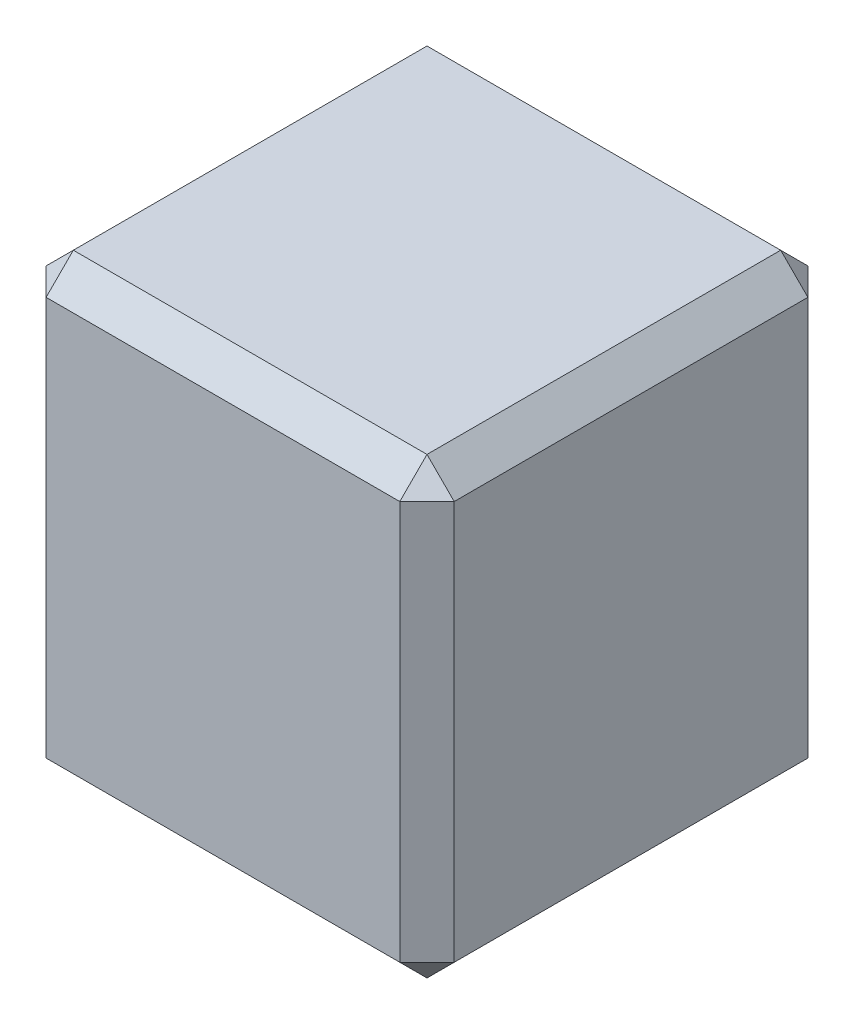
ISO-10303-21;
HEADER;
FILE_DESCRIPTION(('STEP AP214'),'2;1');
FILE_NAME('part.step','',(''),(''),'','','');
FILE_SCHEMA(('AUTOMOTIVE_DESIGN { 1 0 10303 214 1 1 1 1 }'));
ENDSEC;
DATA;
#1=APPLICATION_CONTEXT('core data for automotive mechanical design processes');
#2=APPLICATION_PROTOCOL_DEFINITION('international standard','automotive_design',2000,#1);
#3=PRODUCT_CONTEXT('',#1,'mechanical');
#4=PRODUCT('Part','Part','',(#3));
#5=PRODUCT_RELATED_PRODUCT_CATEGORY('part','',(#4));
#6=PRODUCT_DEFINITION_FORMATION('','',#4);
#7=PRODUCT_DEFINITION_CONTEXT('part definition',#1,'design');
#8=PRODUCT_DEFINITION('design','',#6,#7);
#9=PRODUCT_DEFINITION_SHAPE('','',#8);
#10=(LENGTH_UNIT() NAMED_UNIT(*) SI_UNIT(.MILLI.,.METRE.));
#11=(NAMED_UNIT(*) PLANE_ANGLE_UNIT() SI_UNIT($,.RADIAN.));
#12=(NAMED_UNIT(*) SI_UNIT($,.STERADIAN.) SOLID_ANGLE_UNIT());
#13=UNCERTAINTY_MEASURE_WITH_UNIT(LENGTH_MEASURE(1.E-05),#10,'distance_accuracy_value','');
#14=(GEOMETRIC_REPRESENTATION_CONTEXT(3) GLOBAL_UNCERTAINTY_ASSIGNED_CONTEXT((#13)) GLOBAL_UNIT_ASSIGNED_CONTEXT((#10,
#11,#12)) REPRESENTATION_CONTEXT('',''));
#15=CARTESIAN_POINT('',(0.,0.,0.));
#16=DIRECTION('',(0.,0.,1.));
#17=DIRECTION('',(1.,0.,0.));
#18=AXIS2_PLACEMENT_3D('',#15,#16,#17);
#19=CARTESIAN_POINT('',(22.5,50.,-22.5));
#20=DIRECTION('',(-1.,0.,0.));
#21=DIRECTION('',(0.,0.,1.));
#22=AXIS2_PLACEMENT_3D('',#19,#20,#21);
#23=PLANE('',#22);
#24=DIRECTION('',(0.,1.,0.));
#25=VECTOR('',#24,1.);
#26=CARTESIAN_POINT('',(22.5,50.,-19.5));
#27=LINE('',#26,#25);
#28=CARTESIAN_POINT('',(22.5,3.00000000000002,-19.5));
#29=VERTEX_POINT('',#28);
#30=CARTESIAN_POINT('',(22.5,47.,-19.5));
#31=VERTEX_POINT('',#30);
#32=EDGE_CURVE('E192',#29,#31,#27,.T.);
#33=ORIENTED_EDGE('',*,*,#32,.T.);
#34=DIRECTION('',(0.,0.,1.));
#35=VECTOR('',#34,1.);
#36=CARTESIAN_POINT('',(22.5,47.,22.5));
#37=LINE('',#36,#35);
#38=CARTESIAN_POINT('',(22.5,47.,19.5));
#39=VERTEX_POINT('',#38);
#40=EDGE_CURVE('E198',#31,#39,#37,.T.);
#41=ORIENTED_EDGE('',*,*,#40,.T.);
#42=DIRECTION('',(0.,-1.,0.));
#43=VECTOR('',#42,1.);
#44=CARTESIAN_POINT('',(22.5,50.,19.5));
#45=LINE('',#44,#43);
#46=CARTESIAN_POINT('',(22.5,3.00000000000002,19.5));
#47=VERTEX_POINT('',#46);
#48=EDGE_CURVE('E196',#39,#47,#45,.T.);
#49=ORIENTED_EDGE('',*,*,#48,.T.);
#50=DIRECTION('',(0.,0.,-1.));
#51=VECTOR('',#50,1.);
#52=CARTESIAN_POINT('',(22.5,3.00000000000002,-22.5));
#53=LINE('',#52,#51);
#54=EDGE_CURVE('E194',#47,#29,#53,.T.);
#55=ORIENTED_EDGE('',*,*,#54,.T.);
#56=EDGE_LOOP('',(#33,#41,#49,#55));
#57=FACE_BOUND('',#56,.T.);
#58=ADVANCED_FACE('F35',(#57),#23,.F.);
#59=CARTESIAN_POINT('',(-22.5,50.,-22.5));
#60=DIRECTION('',(0.,0.,1.));
#61=DIRECTION('',(1.,0.,0.));
#62=AXIS2_PLACEMENT_3D('',#59,#60,#61);
#63=PLANE('',#62);
#64=DIRECTION('',(0.,1.,0.));
#65=VECTOR('',#64,1.);
#66=CARTESIAN_POINT('',(-19.5,50.,-22.5));
#67=LINE('',#66,#65);
#68=CARTESIAN_POINT('',(-19.5,3.,-22.5));
#69=VERTEX_POINT('',#68);
#70=CARTESIAN_POINT('',(-19.5,47.,-22.5));
#71=VERTEX_POINT('',#70);
#72=EDGE_CURVE('E187',#69,#71,#67,.T.);
#73=ORIENTED_EDGE('',*,*,#72,.T.);
#74=DIRECTION('',(1.,0.,0.));
#75=VECTOR('',#74,1.);
#76=CARTESIAN_POINT('',(22.5,47.,-22.5));
#77=LINE('',#76,#75);
#78=CARTESIAN_POINT('',(19.5,47.,-22.5));
#79=VERTEX_POINT('',#78);
#80=EDGE_CURVE('E189',#71,#79,#77,.T.);
#81=ORIENTED_EDGE('',*,*,#80,.T.);
#82=DIRECTION('',(0.,-1.,0.));
#83=VECTOR('',#82,1.);
#84=CARTESIAN_POINT('',(19.5,50.,-22.5));
#85=LINE('',#84,#83);
#86=CARTESIAN_POINT('',(19.5,3.,-22.5));
#87=VERTEX_POINT('',#86);
#88=EDGE_CURVE('E183',#79,#87,#85,.T.);
#89=ORIENTED_EDGE('',*,*,#88,.T.);
#90=DIRECTION('',(-1.,0.,0.));
#91=VECTOR('',#90,1.);
#92=CARTESIAN_POINT('',(-22.5,3.,-22.5));
#93=LINE('',#92,#91);
#94=EDGE_CURVE('E185',#87,#69,#93,.T.);
#95=ORIENTED_EDGE('',*,*,#94,.T.);
#96=EDGE_LOOP('',(#73,#81,#89,#95));
#97=FACE_BOUND('',#96,.T.);
#98=CARTESIAN_POINT('',(0.,12.5,-22.5));
#99=DIRECTION('',(0.,0.,-1.));
#100=DIRECTION('',(-1.,0.,0.));
#101=AXIS2_PLACEMENT_3D('',#98,#99,#100);
#102=CIRCLE('',#101,4.15);
#103=CARTESIAN_POINT('',(-4.15,12.5,-22.5));
#104=VERTEX_POINT('',#103);
#105=EDGE_CURVE('E271',#104,#104,#102,.T.);
#106=ORIENTED_EDGE('',*,*,#105,.F.);
#107=EDGE_LOOP('',(#106));
#108=FACE_BOUND('',#107,.T.);
#109=ADVANCED_FACE('F327',(#97,#108),#63,.F.);
#110=CARTESIAN_POINT('',(-22.5,50.,-22.5));
#111=DIRECTION('',(1.,0.,0.));
#112=DIRECTION('',(0.,0.,-1.));
#113=AXIS2_PLACEMENT_3D('',#110,#111,#112);
#114=PLANE('',#113);
#115=DIRECTION('',(0.,1.,0.));
#116=VECTOR('',#115,1.);
#117=CARTESIAN_POINT('',(-22.5,50.,19.5));
#118=LINE('',#117,#116);
#119=CARTESIAN_POINT('',(-22.5,3.,19.5));
#120=VERTEX_POINT('',#119);
#121=CARTESIAN_POINT('',(-22.5,47.,19.5));
#122=VERTEX_POINT('',#121);
#123=EDGE_CURVE('E178',#120,#122,#118,.T.);
#124=ORIENTED_EDGE('',*,*,#123,.T.);
#125=DIRECTION('',(0.,0.,-1.));
#126=VECTOR('',#125,1.);
#127=CARTESIAN_POINT('',(-22.5,47.,-22.5));
#128=LINE('',#127,#126);
#129=CARTESIAN_POINT('',(-22.5,47.,-19.5));
#130=VERTEX_POINT('',#129);
#131=EDGE_CURVE('E180',#122,#130,#128,.T.);
#132=ORIENTED_EDGE('',*,*,#131,.T.);
#133=DIRECTION('',(0.,-1.,0.));
#134=VECTOR('',#133,1.);
#135=CARTESIAN_POINT('',(-22.5,50.,-19.5));
#136=LINE('',#135,#134);
#137=CARTESIAN_POINT('',(-22.5,3.,-19.5));
#138=VERTEX_POINT('',#137);
#139=EDGE_CURVE('E174',#130,#138,#136,.T.);
#140=ORIENTED_EDGE('',*,*,#139,.T.);
#141=DIRECTION('',(0.,0.,1.));
#142=VECTOR('',#141,1.);
#143=CARTESIAN_POINT('',(-22.5,3.,-22.5));
#144=LINE('',#143,#142);
#145=EDGE_CURVE('E176',#138,#120,#144,.T.);
#146=ORIENTED_EDGE('',*,*,#145,.T.);
#147=EDGE_LOOP('',(#124,#132,#140,#146));
#148=FACE_BOUND('',#147,.T.);
#149=CARTESIAN_POINT('',(-22.5,37.5,0.));
#150=DIRECTION('',(-1.,0.,0.));
#151=DIRECTION('',(0.,0.,1.));
#152=AXIS2_PLACEMENT_3D('',#149,#150,#151);
#153=CIRCLE('',#152,4.15);
#154=CARTESIAN_POINT('',(-22.5,37.5,4.15000000000001));
#155=VERTEX_POINT('',#154);
#156=EDGE_CURVE('E260',#155,#155,#153,.T.);
#157=ORIENTED_EDGE('',*,*,#156,.F.);
#158=EDGE_LOOP('',(#157));
#159=FACE_BOUND('',#158,.T.);
#160=ADVANCED_FACE('F332',(#148,#159),#114,.F.);
#161=CARTESIAN_POINT('',(-22.5,50.,22.5));
#162=DIRECTION('',(0.,0.,-1.));
#163=DIRECTION('',(-1.,0.,0.));
#164=AXIS2_PLACEMENT_3D('',#161,#162,#163);
#165=PLANE('',#164);
#166=DIRECTION('',(1.,0.,0.));
#167=VECTOR('',#166,1.);
#168=CARTESIAN_POINT('',(-22.5,3.,22.5));
#169=LINE('',#168,#167);
#170=CARTESIAN_POINT('',(-19.5,3.,22.5));
#171=VERTEX_POINT('',#170);
#172=CARTESIAN_POINT('',(19.5,3.,22.5));
#173=VERTEX_POINT('',#172);
#174=EDGE_CURVE('E165',#171,#173,#169,.T.);
#175=ORIENTED_EDGE('',*,*,#174,.T.);
#176=DIRECTION('',(0.,1.,0.));
#177=VECTOR('',#176,1.);
#178=CARTESIAN_POINT('',(19.5,50.,22.5));
#179=LINE('',#178,#177);
#180=CARTESIAN_POINT('',(19.5,47.,22.5));
#181=VERTEX_POINT('',#180);
#182=EDGE_CURVE('E172',#173,#181,#179,.T.);
#183=ORIENTED_EDGE('',*,*,#182,.T.);
#184=DIRECTION('',(-1.,0.,0.));
#185=VECTOR('',#184,1.);
#186=CARTESIAN_POINT('',(-22.5,47.,22.5));
#187=LINE('',#186,#185);
#188=CARTESIAN_POINT('',(-19.5,47.,22.5));
#189=VERTEX_POINT('',#188);
#190=EDGE_CURVE('E134',#181,#189,#187,.T.);
#191=ORIENTED_EDGE('',*,*,#190,.T.);
#192=DIRECTION('',(0.,-1.,0.));
#193=VECTOR('',#192,1.);
#194=CARTESIAN_POINT('',(-19.5,50.,22.5));
#195=LINE('',#194,#193);
#196=EDGE_CURVE('E163',#189,#171,#195,.T.);
#197=ORIENTED_EDGE('',*,*,#196,.T.);
#198=EDGE_LOOP('',(#175,#183,#191,#197));
#199=FACE_BOUND('',#198,.T.);
#200=ADVANCED_FACE('F300',(#199),#165,.F.);
#201=CARTESIAN_POINT('',(0.,50.,0.));
#202=DIRECTION('',(0.,1.,0.));
#203=DIRECTION('',(0.,0.,1.));
#204=AXIS2_PLACEMENT_3D('',#201,#202,#203);
#205=PLANE('',#204);
#206=DIRECTION('',(0.,0.,1.));
#207=VECTOR('',#206,1.);
#208=CARTESIAN_POINT('',(-19.5,50.,22.5));
#209=LINE('',#208,#207);
#210=CARTESIAN_POINT('',(-19.5,50.,-19.5));
#211=VERTEX_POINT('',#210);
#212=CARTESIAN_POINT('',(-19.5,50.,19.5));
#213=VERTEX_POINT('',#212);
#214=EDGE_CURVE('E161',#211,#213,#209,.T.);
#215=ORIENTED_EDGE('',*,*,#214,.T.);
#216=DIRECTION('',(1.,0.,0.));
#217=VECTOR('',#216,1.);
#218=CARTESIAN_POINT('',(22.5,50.,19.5));
#219=LINE('',#218,#217);
#220=CARTESIAN_POINT('',(19.5,50.,19.5));
#221=VERTEX_POINT('',#220);
#222=EDGE_CURVE('E132',#213,#221,#219,.T.);
#223=ORIENTED_EDGE('',*,*,#222,.T.);
#224=DIRECTION('',(0.,0.,-1.));
#225=VECTOR('',#224,1.);
#226=CARTESIAN_POINT('',(19.5,50.,-22.5));
#227=LINE('',#226,#225);
#228=CARTESIAN_POINT('',(19.5,50.,-19.5));
#229=VERTEX_POINT('',#228);
#230=EDGE_CURVE('E150',#221,#229,#227,.T.);
#231=ORIENTED_EDGE('',*,*,#230,.T.);
#232=DIRECTION('',(-1.,0.,0.));
#233=VECTOR('',#232,1.);
#234=CARTESIAN_POINT('',(-22.5,50.,-19.5));
#235=LINE('',#234,#233);
#236=EDGE_CURVE('E156',#229,#211,#235,.T.);
#237=ORIENTED_EDGE('',*,*,#236,.T.);
#238=EDGE_LOOP('',(#215,#223,#231,#237));
#239=FACE_BOUND('',#238,.T.);
#240=ADVANCED_FACE('F159',(#239),#205,.T.);
#241=CARTESIAN_POINT('',(0.,0.,0.));
#242=DIRECTION('',(0.,1.,0.));
#243=DIRECTION('',(0.,0.,1.));
#244=AXIS2_PLACEMENT_3D('',#241,#242,#243);
#245=PLANE('',#244);
#246=DIRECTION('',(0.,0.,1.));
#247=VECTOR('',#246,1.);
#248=CARTESIAN_POINT('',(19.5,0.,0.));
#249=LINE('',#248,#247);
#250=CARTESIAN_POINT('',(19.5,0.,-19.5));
#251=VERTEX_POINT('',#250);
#252=CARTESIAN_POINT('',(19.5,0.,19.5));
#253=VERTEX_POINT('',#252);
#254=EDGE_CURVE('E44',#251,#253,#249,.T.);
#255=ORIENTED_EDGE('',*,*,#254,.T.);
#256=DIRECTION('',(-1.,0.,0.));
#257=VECTOR('',#256,1.);
#258=CARTESIAN_POINT('',(0.,0.,19.5));
#259=LINE('',#258,#257);
#260=CARTESIAN_POINT('',(-19.5,0.,19.5));
#261=VERTEX_POINT('',#260);
#262=EDGE_CURVE('E11',#253,#261,#259,.T.);
#263=ORIENTED_EDGE('',*,*,#262,.T.);
#264=DIRECTION('',(0.,0.,-1.));
#265=VECTOR('',#264,1.);
#266=CARTESIAN_POINT('',(-19.5,0.,0.));
#267=LINE('',#266,#265);
#268=CARTESIAN_POINT('',(-19.5,0.,-19.5));
#269=VERTEX_POINT('',#268);
#270=EDGE_CURVE('E203',#261,#269,#267,.T.);
#271=ORIENTED_EDGE('',*,*,#270,.T.);
#272=DIRECTION('',(1.,0.,0.));
#273=VECTOR('',#272,1.);
#274=CARTESIAN_POINT('',(0.,0.,-19.5));
#275=LINE('',#274,#273);
#276=EDGE_CURVE('E201',#269,#251,#275,.T.);
#277=ORIENTED_EDGE('',*,*,#276,.T.);
#278=EDGE_LOOP('',(#255,#263,#271,#277));
#279=FACE_BOUND('',#278,.T.);
#280=ADVANCED_FACE('F521',(#279),#245,.F.);
#281=CARTESIAN_POINT('',(0.,12.5,7.5));
#282=DIRECTION('',(0.,0.,-1.));
#283=DIRECTION('',(-1.,0.,0.));
#284=AXIS2_PLACEMENT_3D('',#281,#282,#283);
#285=CYLINDRICAL_SURFACE('',#284,4.15);
#286=CARTESIAN_POINT('',(0.,12.5,7.5));
#287=DIRECTION('',(0.,0.,-1.));
#288=DIRECTION('',(-1.,0.,0.));
#289=AXIS2_PLACEMENT_3D('',#286,#287,#288);
#290=CIRCLE('',#289,4.15);
#291=CARTESIAN_POINT('',(-4.15,12.5,7.5));
#292=VERTEX_POINT('',#291);
#293=EDGE_CURVE('E157',#292,#292,#290,.T.);
#294=ORIENTED_EDGE('',*,*,#293,.F.);
#295=EDGE_LOOP('',(#294));
#296=FACE_BOUND('',#295,.T.);
#297=ORIENTED_EDGE('',*,*,#105,.T.);
#298=EDGE_LOOP('',(#297));
#299=FACE_BOUND('',#298,.T.);
#300=ADVANCED_FACE('F512',(#296,#299),#285,.F.);
#301=CARTESIAN_POINT('',(0.,12.5,7.5));
#302=DIRECTION('',(0.,0.,-1.));
#303=DIRECTION('',(-1.,0.,0.));
#304=AXIS2_PLACEMENT_3D('',#301,#302,#303);
#305=PLANE('',#304);
#306=ORIENTED_EDGE('',*,*,#293,.T.);
#307=EDGE_LOOP('',(#306));
#308=FACE_BOUND('',#307,.T.);
#309=ADVANCED_FACE('F503',(#308),#305,.T.);
#310=CARTESIAN_POINT('',(7.50000000000001,37.5,0.));
#311=DIRECTION('',(-1.,0.,0.));
#312=DIRECTION('',(0.,0.,1.));
#313=AXIS2_PLACEMENT_3D('',#310,#311,#312);
#314=CYLINDRICAL_SURFACE('',#313,4.15);
#315=CARTESIAN_POINT('',(7.50000000000001,37.5,0.));
#316=DIRECTION('',(-1.,0.,0.));
#317=DIRECTION('',(0.,0.,1.));
#318=AXIS2_PLACEMENT_3D('',#315,#316,#317);
#319=CIRCLE('',#318,4.15);
#320=CARTESIAN_POINT('',(7.50000000000001,37.5,4.15));
#321=VERTEX_POINT('',#320);
#322=EDGE_CURVE('E266',#321,#321,#319,.T.);
#323=ORIENTED_EDGE('',*,*,#322,.F.);
#324=EDGE_LOOP('',(#323));
#325=FACE_BOUND('',#324,.T.);
#326=ORIENTED_EDGE('',*,*,#156,.T.);
#327=EDGE_LOOP('',(#326));
#328=FACE_BOUND('',#327,.T.);
#329=ADVANCED_FACE('F494',(#325,#328),#314,.F.);
#330=CARTESIAN_POINT('',(7.50000000000001,37.5,0.));
#331=DIRECTION('',(-1.,0.,0.));
#332=DIRECTION('',(0.,0.,1.));
#333=AXIS2_PLACEMENT_3D('',#330,#331,#332);
#334=PLANE('',#333);
#335=ORIENTED_EDGE('',*,*,#322,.T.);
#336=EDGE_LOOP('',(#335));
#337=FACE_BOUND('',#336,.T.);
#338=ADVANCED_FACE('F485',(#337),#334,.T.);
#339=CARTESIAN_POINT('',(-22.5,3.,-22.5));
#340=DIRECTION('',(0.,0.707106781186549,0.707106781186546));
#341=DIRECTION('',(-1.,0.,0.));
#342=AXIS2_PLACEMENT_3D('',#339,#340,#341);
#343=PLANE('',#342);
#344=DIRECTION('',(0.,0.707106781186546,-0.707106781186549));
#345=VECTOR('',#344,1.);
#346=CARTESIAN_POINT('',(-19.5,0.,-19.5));
#347=LINE('',#346,#345);
#348=EDGE_CURVE('E39',#69,#269,#347,.F.);
#349=ORIENTED_EDGE('',*,*,#348,.F.);
#350=ORIENTED_EDGE('',*,*,#94,.F.);
#351=DIRECTION('',(0.,-0.707106781186546,0.707106781186549));
#352=VECTOR('',#351,1.);
#353=CARTESIAN_POINT('',(19.5,1.5,-21.));
#354=LINE('',#353,#352);
#355=EDGE_CURVE('E253',#251,#87,#354,.F.);
#356=ORIENTED_EDGE('',*,*,#355,.F.);
#357=ORIENTED_EDGE('',*,*,#276,.F.);
#358=EDGE_LOOP('',(#349,#350,#356,#357));
#359=FACE_BOUND('',#358,.T.);
#360=ADVANCED_FACE('F37',(#359),#343,.F.);
#361=CARTESIAN_POINT('',(-19.5,0.,-19.5));
#362=DIRECTION('',(-0.577350269189626,-0.577350269189628,-0.577350269189623));
#363=DIRECTION('',(0.707106781186549,-0.707106781186546,0.));
#364=AXIS2_PLACEMENT_3D('',#361,#362,#363);
#365=PLANE('',#364);
#366=DIRECTION('',(-0.707106781186546,0.,0.707106781186549));
#367=VECTOR('',#366,1.);
#368=CARTESIAN_POINT('',(-21.,3.,-21.));
#369=LINE('',#368,#367);
#370=EDGE_CURVE('E248',#69,#138,#369,.T.);
#371=ORIENTED_EDGE('',*,*,#370,.F.);
#372=ORIENTED_EDGE('',*,*,#348,.T.);
#373=DIRECTION('',(0.707106781186549,-0.707106781186546,0.));
#374=VECTOR('',#373,1.);
#375=CARTESIAN_POINT('',(-19.5,0.,-19.5));
#376=LINE('',#375,#374);
#377=EDGE_CURVE('E251',#138,#269,#376,.T.);
#378=ORIENTED_EDGE('',*,*,#377,.F.);
#379=EDGE_LOOP('',(#371,#372,#378));
#380=FACE_BOUND('',#379,.T.);
#381=ADVANCED_FACE('F471',(#380),#365,.T.);
#382=CARTESIAN_POINT('',(22.5,3.00000000000002,-19.5));
#383=DIRECTION('',(0.577350269189628,-0.577350269189625,-0.577350269189624));
#384=DIRECTION('',(0.707106781186546,0.707106781186549,0.));
#385=AXIS2_PLACEMENT_3D('',#382,#383,#384);
#386=PLANE('',#385);
#387=DIRECTION('',(0.707106781186546,0.707106781186549,0.));
#388=VECTOR('',#387,1.);
#389=CARTESIAN_POINT('',(22.5,3.00000000000002,-19.5));
#390=LINE('',#389,#388);
#391=EDGE_CURVE('E242',#251,#29,#390,.T.);
#392=ORIENTED_EDGE('',*,*,#391,.F.);
#393=ORIENTED_EDGE('',*,*,#355,.T.);
#394=DIRECTION('',(-0.707106781186547,0.,-0.707106781186548));
#395=VECTOR('',#394,1.);
#396=CARTESIAN_POINT('',(22.5,3.00000000000002,-19.5));
#397=LINE('',#396,#395);
#398=EDGE_CURVE('E245',#29,#87,#397,.T.);
#399=ORIENTED_EDGE('',*,*,#398,.F.);
#400=EDGE_LOOP('',(#392,#393,#399));
#401=FACE_BOUND('',#400,.T.);
#402=ADVANCED_FACE('F462',(#401),#386,.T.);
#403=CARTESIAN_POINT('',(-22.5,3.,-22.5));
#404=DIRECTION('',(0.707106781186546,0.707106781186549,0.));
#405=DIRECTION('',(0.,0.,1.));
#406=AXIS2_PLACEMENT_3D('',#403,#404,#405);
#407=PLANE('',#406);
#408=ORIENTED_EDGE('',*,*,#377,.T.);
#409=ORIENTED_EDGE('',*,*,#270,.F.);
#410=DIRECTION('',(-0.707106781186549,0.707106781186546,0.));
#411=VECTOR('',#410,1.);
#412=CARTESIAN_POINT('',(-19.5,0.,19.5));
#413=LINE('',#412,#411);
#414=EDGE_CURVE('E58',#120,#261,#413,.F.);
#415=ORIENTED_EDGE('',*,*,#414,.F.);
#416=ORIENTED_EDGE('',*,*,#145,.F.);
#417=EDGE_LOOP('',(#408,#409,#415,#416));
#418=FACE_BOUND('',#417,.T.);
#419=ADVANCED_FACE('F453',(#418),#407,.F.);
#420=CARTESIAN_POINT('',(-22.5,50.,-19.5));
#421=DIRECTION('',(0.707106781186549,0.,0.707106781186546));
#422=DIRECTION('',(0.,-1.,0.));
#423=AXIS2_PLACEMENT_3D('',#420,#421,#422);
#424=PLANE('',#423);
#425=ORIENTED_EDGE('',*,*,#370,.T.);
#426=ORIENTED_EDGE('',*,*,#139,.F.);
#427=DIRECTION('',(0.707106781186546,0.,-0.707106781186549));
#428=VECTOR('',#427,1.);
#429=CARTESIAN_POINT('',(-22.5,47.,-19.5));
#430=LINE('',#429,#428);
#431=EDGE_CURVE('E236',#71,#130,#430,.F.);
#432=ORIENTED_EDGE('',*,*,#431,.F.);
#433=ORIENTED_EDGE('',*,*,#72,.F.);
#434=EDGE_LOOP('',(#425,#426,#432,#433));
#435=FACE_BOUND('',#434,.T.);
#436=ADVANCED_FACE('F445',(#435),#424,.F.);
#437=CARTESIAN_POINT('',(0.,50.,-19.5));
#438=DIRECTION('',(0.,0.707106781186549,-0.707106781186546));
#439=DIRECTION('',(1.,0.,0.));
#440=AXIS2_PLACEMENT_3D('',#437,#438,#439);
#441=PLANE('',#440);
#442=DIRECTION('',(0.,0.707106781186546,0.707106781186549));
#443=VECTOR('',#442,1.);
#444=CARTESIAN_POINT('',(19.5,47.,-22.5));
#445=LINE('',#444,#443);
#446=EDGE_CURVE('E230',#79,#229,#445,.T.);
#447=ORIENTED_EDGE('',*,*,#446,.F.);
#448=ORIENTED_EDGE('',*,*,#80,.F.);
#449=DIRECTION('',(0.,-0.707106781186546,-0.707106781186549));
#450=VECTOR('',#449,1.);
#451=CARTESIAN_POINT('',(-19.5,48.5,-21.));
#452=LINE('',#451,#450);
#453=EDGE_CURVE('E233',#211,#71,#452,.T.);
#454=ORIENTED_EDGE('',*,*,#453,.F.);
#455=ORIENTED_EDGE('',*,*,#236,.F.);
#456=EDGE_LOOP('',(#447,#448,#454,#455));
#457=FACE_BOUND('',#456,.T.);
#458=ADVANCED_FACE('F282',(#457),#441,.T.);
#459=CARTESIAN_POINT('',(19.5,50.,-22.5));
#460=DIRECTION('',(-0.707106781186548,0.,0.707106781186547));
#461=DIRECTION('',(0.,-1.,0.));
#462=AXIS2_PLACEMENT_3D('',#459,#460,#461);
#463=PLANE('',#462);
#464=ORIENTED_EDGE('',*,*,#398,.T.);
#465=ORIENTED_EDGE('',*,*,#88,.F.);
#466=DIRECTION('',(0.707106781186547,0.,0.707106781186548));
#467=VECTOR('',#466,1.);
#468=CARTESIAN_POINT('',(19.5,47.,-22.5));
#469=LINE('',#468,#467);
#470=EDGE_CURVE('E228',#31,#79,#469,.F.);
#471=ORIENTED_EDGE('',*,*,#470,.F.);
#472=ORIENTED_EDGE('',*,*,#32,.F.);
#473=EDGE_LOOP('',(#464,#465,#471,#472));
#474=FACE_BOUND('',#473,.T.);
#475=ADVANCED_FACE('F312',(#474),#463,.F.);
#476=CARTESIAN_POINT('',(22.5,3.00000000000002,-22.5));
#477=DIRECTION('',(-0.707106781186549,0.707106781186546,0.));
#478=DIRECTION('',(0.,0.,-1.));
#479=AXIS2_PLACEMENT_3D('',#476,#477,#478);
#480=PLANE('',#479);
#481=ORIENTED_EDGE('',*,*,#391,.T.);
#482=ORIENTED_EDGE('',*,*,#54,.F.);
#483=DIRECTION('',(-0.707106781186546,-0.707106781186549,0.));
#484=VECTOR('',#483,1.);
#485=CARTESIAN_POINT('',(21.,1.5,19.5));
#486=LINE('',#485,#484);
#487=EDGE_CURVE('E225',#253,#47,#486,.F.);
#488=ORIENTED_EDGE('',*,*,#487,.F.);
#489=ORIENTED_EDGE('',*,*,#254,.F.);
#490=EDGE_LOOP('',(#481,#482,#488,#489));
#491=FACE_BOUND('',#490,.T.);
#492=ADVANCED_FACE('F421',(#491),#480,.F.);
#493=CARTESIAN_POINT('',(-22.5,3.,22.5));
#494=DIRECTION('',(0.,0.707106781186549,-0.707106781186546));
#495=DIRECTION('',(1.,0.,0.));
#496=AXIS2_PLACEMENT_3D('',#493,#494,#495);
#497=PLANE('',#496);
#498=DIRECTION('',(0.,-0.707106781186546,-0.707106781186549));
#499=VECTOR('',#498,1.);
#500=CARTESIAN_POINT('',(-19.5,0.,19.5));
#501=LINE('',#500,#499);
#502=EDGE_CURVE('E240',#261,#171,#501,.F.);
#503=ORIENTED_EDGE('',*,*,#502,.F.);
#504=ORIENTED_EDGE('',*,*,#262,.F.);
#505=DIRECTION('',(0.,0.707106781186546,0.707106781186549));
#506=VECTOR('',#505,1.);
#507=CARTESIAN_POINT('',(19.5,3.,22.5));
#508=LINE('',#507,#506);
#509=EDGE_CURVE('E222',#173,#253,#508,.F.);
#510=ORIENTED_EDGE('',*,*,#509,.F.);
#511=ORIENTED_EDGE('',*,*,#174,.F.);
#512=EDGE_LOOP('',(#503,#504,#510,#511));
#513=FACE_BOUND('',#512,.T.);
#514=ADVANCED_FACE('F413',(#513),#497,.F.);
#515=CARTESIAN_POINT('',(-19.5,0.,19.5));
#516=DIRECTION('',(-0.577350269189627,-0.577350269189628,0.577350269189623));
#517=DIRECTION('',(0.707106781186548,-0.707106781186547,0.));
#518=AXIS2_PLACEMENT_3D('',#515,#516,#517);
#519=PLANE('',#518);
#520=ORIENTED_EDGE('',*,*,#414,.T.);
#521=ORIENTED_EDGE('',*,*,#502,.T.);
#522=DIRECTION('',(0.707106781186545,0.,0.70710678118655));
#523=VECTOR('',#522,1.);
#524=CARTESIAN_POINT('',(-21.,3.,21.));
#525=LINE('',#524,#523);
#526=EDGE_CURVE('E219',#120,#171,#525,.T.);
#527=ORIENTED_EDGE('',*,*,#526,.F.);
#528=EDGE_LOOP('',(#520,#521,#527));
#529=FACE_BOUND('',#528,.T.);
#530=ADVANCED_FACE('F324',(#529),#519,.T.);
#531=CARTESIAN_POINT('',(-22.5,47.,-19.5));
#532=DIRECTION('',(-0.577350269189628,0.577350269189626,-0.577350269189623));
#533=DIRECTION('',(-0.707106781186546,-0.707106781186549,0.));
#534=AXIS2_PLACEMENT_3D('',#531,#532,#533);
#535=PLANE('',#534);
#536=ORIENTED_EDGE('',*,*,#453,.T.);
#537=ORIENTED_EDGE('',*,*,#431,.T.);
#538=DIRECTION('',(0.707106781186546,0.707106781186549,0.));
#539=VECTOR('',#538,1.);
#540=CARTESIAN_POINT('',(-22.5,47.,-19.5));
#541=LINE('',#540,#539);
#542=EDGE_CURVE('E217',#211,#130,#541,.F.);
#543=ORIENTED_EDGE('',*,*,#542,.F.);
#544=EDGE_LOOP('',(#536,#537,#543));
#545=FACE_BOUND('',#544,.T.);
#546=ADVANCED_FACE('F285',(#545),#535,.T.);
#547=CARTESIAN_POINT('',(19.5,47.,-22.5));
#548=DIRECTION('',(0.577350269189628,0.577350269189625,-0.577350269189624));
#549=DIRECTION('',(-0.707106781186546,0.707106781186549,0.));
#550=AXIS2_PLACEMENT_3D('',#547,#548,#549);
#551=PLANE('',#550);
#552=ORIENTED_EDGE('',*,*,#470,.T.);
#553=ORIENTED_EDGE('',*,*,#446,.T.);
#554=DIRECTION('',(0.707106781186546,-0.707106781186549,0.));
#555=VECTOR('',#554,1.);
#556=CARTESIAN_POINT('',(21.,48.5,-19.5));
#557=LINE('',#556,#555);
#558=EDGE_CURVE('E153',#31,#229,#557,.F.);
#559=ORIENTED_EDGE('',*,*,#558,.F.);
#560=EDGE_LOOP('',(#552,#553,#559));
#561=FACE_BOUND('',#560,.T.);
#562=ADVANCED_FACE('F314',(#561),#551,.T.);
#563=CARTESIAN_POINT('',(19.5,3.,22.5));
#564=DIRECTION('',(0.577350269189629,-0.577350269189625,0.577350269189624));
#565=DIRECTION('',(0.707106781186545,0.70710678118655,0.));
#566=AXIS2_PLACEMENT_3D('',#563,#564,#565);
#567=PLANE('',#566);
#568=ORIENTED_EDGE('',*,*,#509,.T.);
#569=ORIENTED_EDGE('',*,*,#487,.T.);
#570=DIRECTION('',(0.707106781186546,0.,-0.707106781186549));
#571=VECTOR('',#570,1.);
#572=CARTESIAN_POINT('',(19.5,3.,22.5));
#573=LINE('',#572,#571);
#574=EDGE_CURVE('E213',#173,#47,#573,.T.);
#575=ORIENTED_EDGE('',*,*,#574,.F.);
#576=EDGE_LOOP('',(#568,#569,#575));
#577=FACE_BOUND('',#576,.T.);
#578=ADVANCED_FACE('F316',(#577),#567,.T.);
#579=CARTESIAN_POINT('',(-19.5,50.,22.5));
#580=DIRECTION('',(0.70710678118655,0.,-0.707106781186545));
#581=DIRECTION('',(0.,-1.,0.));
#582=AXIS2_PLACEMENT_3D('',#579,#580,#581);
#583=PLANE('',#582);
#584=ORIENTED_EDGE('',*,*,#526,.T.);
#585=ORIENTED_EDGE('',*,*,#196,.F.);
#586=DIRECTION('',(-0.707106781186545,0.,-0.70710678118655));
#587=VECTOR('',#586,1.);
#588=CARTESIAN_POINT('',(-19.5,47.,22.5));
#589=LINE('',#588,#587);
#590=EDGE_CURVE('E210',#122,#189,#589,.F.);
#591=ORIENTED_EDGE('',*,*,#590,.F.);
#592=ORIENTED_EDGE('',*,*,#123,.F.);
#593=EDGE_LOOP('',(#584,#585,#591,#592));
#594=FACE_BOUND('',#593,.T.);
#595=ADVANCED_FACE('F297',(#594),#583,.F.);
#596=CARTESIAN_POINT('',(-19.5,50.,0.));
#597=DIRECTION('',(-0.707106781186549,0.707106781186546,0.));
#598=DIRECTION('',(0.,0.,-1.));
#599=AXIS2_PLACEMENT_3D('',#596,#597,#598);
#600=PLANE('',#599);
#601=ORIENTED_EDGE('',*,*,#542,.T.);
#602=ORIENTED_EDGE('',*,*,#131,.F.);
#603=DIRECTION('',(-0.707106781186546,-0.707106781186549,0.));
#604=VECTOR('',#603,1.);
#605=CARTESIAN_POINT('',(-21.,48.5,19.5));
#606=LINE('',#605,#604);
#607=EDGE_CURVE('E147',#213,#122,#606,.T.);
#608=ORIENTED_EDGE('',*,*,#607,.F.);
#609=ORIENTED_EDGE('',*,*,#214,.F.);
#610=EDGE_LOOP('',(#601,#602,#608,#609));
#611=FACE_BOUND('',#610,.T.);
#612=ADVANCED_FACE('F289',(#611),#600,.T.);
#613=CARTESIAN_POINT('',(19.5,50.,0.));
#614=DIRECTION('',(0.707106781186549,0.707106781186546,0.));
#615=DIRECTION('',(0.,0.,1.));
#616=AXIS2_PLACEMENT_3D('',#613,#614,#615);
#617=PLANE('',#616);
#618=ORIENTED_EDGE('',*,*,#558,.T.);
#619=ORIENTED_EDGE('',*,*,#230,.F.);
#620=DIRECTION('',(-0.707106781186546,0.707106781186549,0.));
#621=VECTOR('',#620,1.);
#622=CARTESIAN_POINT('',(19.5,50.,19.5));
#623=LINE('',#622,#621);
#624=EDGE_CURVE('E139',#39,#221,#623,.T.);
#625=ORIENTED_EDGE('',*,*,#624,.F.);
#626=ORIENTED_EDGE('',*,*,#40,.F.);
#627=EDGE_LOOP('',(#618,#619,#625,#626));
#628=FACE_BOUND('',#627,.T.);
#629=ADVANCED_FACE('F151',(#628),#617,.T.);
#630=CARTESIAN_POINT('',(22.5,50.,19.5));
#631=DIRECTION('',(-0.707106781186549,0.,-0.707106781186546));
#632=DIRECTION('',(0.,-1.,0.));
#633=AXIS2_PLACEMENT_3D('',#630,#631,#632);
#634=PLANE('',#633);
#635=ORIENTED_EDGE('',*,*,#574,.T.);
#636=ORIENTED_EDGE('',*,*,#48,.F.);
#637=DIRECTION('',(-0.707106781186546,0.,0.707106781186549));
#638=VECTOR('',#637,1.);
#639=CARTESIAN_POINT('',(21.,47.,21.));
#640=LINE('',#639,#638);
#641=EDGE_CURVE('E143',#181,#39,#640,.F.);
#642=ORIENTED_EDGE('',*,*,#641,.F.);
#643=ORIENTED_EDGE('',*,*,#182,.F.);
#644=EDGE_LOOP('',(#635,#636,#642,#643));
#645=FACE_BOUND('',#644,.T.);
#646=ADVANCED_FACE('F304',(#645),#634,.F.);
#647=CARTESIAN_POINT('',(-19.5,47.,22.5));
#648=DIRECTION('',(-0.577350269189629,0.577350269189623,0.577350269189625));
#649=DIRECTION('',(0.707106781186545,0.,0.70710678118655));
#650=AXIS2_PLACEMENT_3D('',#647,#648,#649);
#651=PLANE('',#650);
#652=ORIENTED_EDGE('',*,*,#607,.T.);
#653=ORIENTED_EDGE('',*,*,#590,.T.);
#654=DIRECTION('',(0.,0.707106781186549,-0.707106781186546));
#655=VECTOR('',#654,1.);
#656=CARTESIAN_POINT('',(-19.5,47.,22.5));
#657=LINE('',#656,#655);
#658=EDGE_CURVE('E136',#213,#189,#657,.F.);
#659=ORIENTED_EDGE('',*,*,#658,.F.);
#660=EDGE_LOOP('',(#652,#653,#659));
#661=FACE_BOUND('',#660,.T.);
#662=ADVANCED_FACE('F293',(#661),#651,.T.);
#663=CARTESIAN_POINT('',(19.5,50.,19.5));
#664=DIRECTION('',(0.577350269189629,0.577350269189622,0.577350269189626));
#665=DIRECTION('',(0.707106781186546,0.,-0.707106781186549));
#666=AXIS2_PLACEMENT_3D('',#663,#664,#665);
#667=PLANE('',#666);
#668=ORIENTED_EDGE('',*,*,#641,.T.);
#669=ORIENTED_EDGE('',*,*,#624,.T.);
#670=DIRECTION('',(0.,-0.707106781186549,0.707106781186546));
#671=VECTOR('',#670,1.);
#672=CARTESIAN_POINT('',(19.5,50.,19.5));
#673=LINE('',#672,#671);
#674=EDGE_CURVE('E128',#181,#221,#673,.F.);
#675=ORIENTED_EDGE('',*,*,#674,.F.);
#676=EDGE_LOOP('',(#668,#669,#675));
#677=FACE_BOUND('',#676,.T.);
#678=ADVANCED_FACE('F141',(#677),#667,.T.);
#679=CARTESIAN_POINT('',(0.,50.,19.5));
#680=DIRECTION('',(0.,0.707106781186546,0.707106781186549));
#681=DIRECTION('',(-1.,0.,0.));
#682=AXIS2_PLACEMENT_3D('',#679,#680,#681);
#683=PLANE('',#682);
#684=ORIENTED_EDGE('',*,*,#658,.T.);
#685=ORIENTED_EDGE('',*,*,#190,.F.);
#686=ORIENTED_EDGE('',*,*,#674,.T.);
#687=ORIENTED_EDGE('',*,*,#222,.F.);
#688=EDGE_LOOP('',(#684,#685,#686,#687));
#689=FACE_BOUND('',#688,.T.);
#690=ADVANCED_FACE('F130',(#689),#683,.T.);
#691=CLOSED_SHELL('',(#58,#109,#160,#200,#240,#280,#300,#309,#329,#338,#360,#381,#402,#419,#436,
#458,#475,#492,#514,#530,#546,#562,#578,#595,#612,#629,#646,#662,#678,#690));
#692=MANIFOLD_SOLID_BREP('B2',#691);
#693=ADVANCED_BREP_SHAPE_REPRESENTATION('',(#18,#692),#14);
#694=SHAPE_DEFINITION_REPRESENTATION(#9,#693);
ENDSEC;
END-ISO-10303-21;
